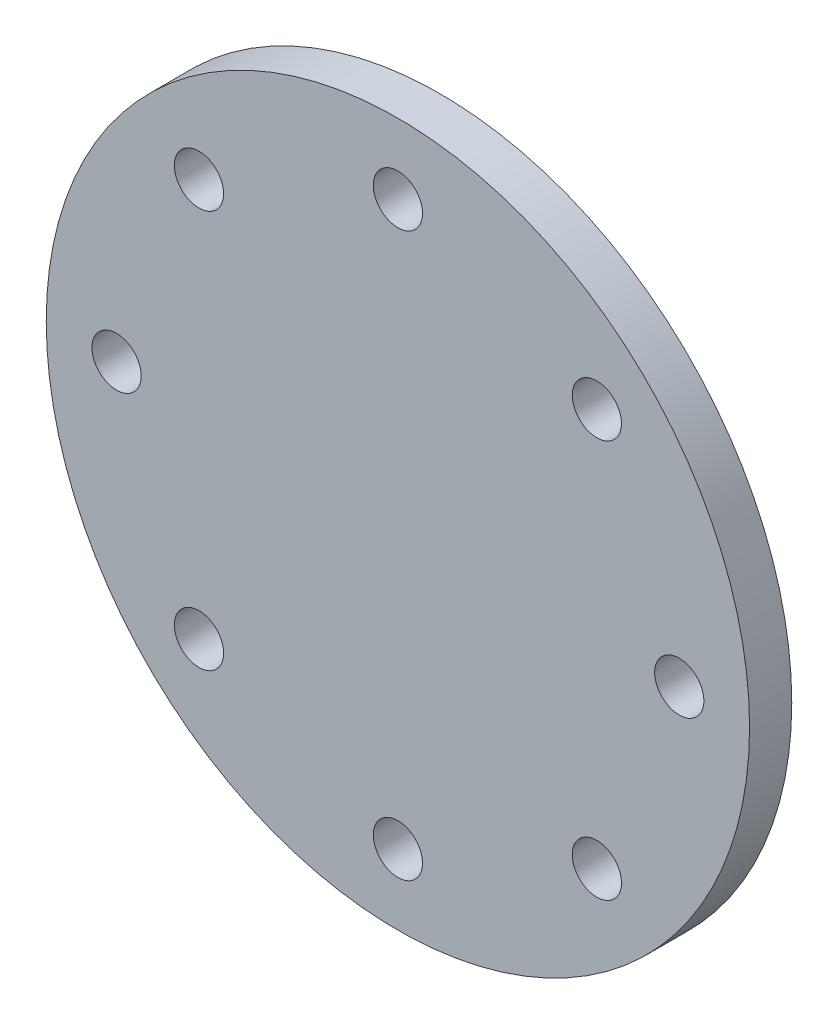
ISO-10303-21;
HEADER;
FILE_DESCRIPTION(('STEP AP214'),'2;1');
FILE_NAME('part.step','',(''),(''),'','','');
FILE_SCHEMA(('AUTOMOTIVE_DESIGN { 1 0 10303 214 1 1 1 1 }'));
ENDSEC;
DATA;
#1=APPLICATION_CONTEXT('core data for automotive mechanical design processes');
#2=APPLICATION_PROTOCOL_DEFINITION('international standard','automotive_design',2000,#1);
#3=PRODUCT_CONTEXT('',#1,'mechanical');
#4=PRODUCT('Part','Part','',(#3));
#5=PRODUCT_RELATED_PRODUCT_CATEGORY('part','',(#4));
#6=PRODUCT_DEFINITION_FORMATION('','',#4);
#7=PRODUCT_DEFINITION_CONTEXT('part definition',#1,'design');
#8=PRODUCT_DEFINITION('design','',#6,#7);
#9=PRODUCT_DEFINITION_SHAPE('','',#8);
#10=(LENGTH_UNIT() NAMED_UNIT(*) SI_UNIT(.MILLI.,.METRE.));
#11=(NAMED_UNIT(*) PLANE_ANGLE_UNIT() SI_UNIT($,.RADIAN.));
#12=(NAMED_UNIT(*) SI_UNIT($,.STERADIAN.) SOLID_ANGLE_UNIT());
#13=UNCERTAINTY_MEASURE_WITH_UNIT(LENGTH_MEASURE(1.E-05),#10,'distance_accuracy_value','');
#14=(GEOMETRIC_REPRESENTATION_CONTEXT(3) GLOBAL_UNCERTAINTY_ASSIGNED_CONTEXT((#13)) GLOBAL_UNIT_ASSIGNED_CONTEXT((#10,
#11,#12)) REPRESENTATION_CONTEXT('',''));
#15=CARTESIAN_POINT('',(0.,0.,0.));
#16=DIRECTION('',(0.,0.,1.));
#17=DIRECTION('',(1.,0.,0.));
#18=AXIS2_PLACEMENT_3D('',#15,#16,#17);
#19=CARTESIAN_POINT('',(0.,0.,3.));
#20=DIRECTION('',(0.,0.,-1.));
#21=DIRECTION('',(-1.,0.,0.));
#22=AXIS2_PLACEMENT_3D('',#19,#20,#21);
#23=CYLINDRICAL_SURFACE('',#22,25.);
#24=CARTESIAN_POINT('',(0.,0.,3.));
#25=DIRECTION('',(0.,0.,1.));
#26=DIRECTION('',(1.,0.,0.));
#27=AXIS2_PLACEMENT_3D('',#24,#25,#26);
#28=CIRCLE('',#27,25.);
#29=CARTESIAN_POINT('',(25.,0.,3.));
#30=VERTEX_POINT('',#29);
#31=EDGE_CURVE('E10',#30,#30,#28,.T.);
#32=ORIENTED_EDGE('',*,*,#31,.F.);
#33=EDGE_LOOP('',(#32));
#34=FACE_BOUND('',#33,.T.);
#35=CARTESIAN_POINT('',(0.,0.,0.));
#36=DIRECTION('',(0.,0.,1.));
#37=DIRECTION('',(1.,0.,0.));
#38=AXIS2_PLACEMENT_3D('',#35,#36,#37);
#39=CIRCLE('',#38,25.);
#40=CARTESIAN_POINT('',(25.,0.,0.));
#41=VERTEX_POINT('',#40);
#42=EDGE_CURVE('E34',#41,#41,#39,.T.);
#43=ORIENTED_EDGE('',*,*,#42,.T.);
#44=EDGE_LOOP('',(#43));
#45=FACE_BOUND('',#44,.T.);
#46=ADVANCED_FACE('F31',(#34,#45),#23,.T.);
#47=CARTESIAN_POINT('',(0.,0.,3.));
#48=DIRECTION('',(0.,0.,1.));
#49=DIRECTION('',(1.,0.,0.));
#50=AXIS2_PLACEMENT_3D('',#47,#48,#49);
#51=PLANE('',#50);
#52=CARTESIAN_POINT('',(14.1421356237308,14.1421356237311,3.));
#53=DIRECTION('',(0.,0.,1.));
#54=DIRECTION('',(0.707106781186556,-0.707106781186539,0.));
#55=AXIS2_PLACEMENT_3D('',#52,#53,#54);
#56=CIRCLE('',#55,1.75);
#57=CARTESIAN_POINT('',(15.3795724908073,12.9046987566547,3.));
#58=VERTEX_POINT('',#57);
#59=EDGE_CURVE('E85',#58,#58,#56,.T.);
#60=ORIENTED_EDGE('',*,*,#59,.F.);
#61=EDGE_LOOP('',(#60));
#62=FACE_BOUND('',#61,.T.);
#63=CARTESIAN_POINT('',(20.,2.09418175640307E-13,3.));
#64=DIRECTION('',(0.,0.,1.));
#65=DIRECTION('',(0.,-1.,0.));
#66=AXIS2_PLACEMENT_3D('',#63,#64,#65);
#67=CIRCLE('',#66,1.75);
#68=CARTESIAN_POINT('',(20.,-1.74999999999979,3.));
#69=VERTEX_POINT('',#68);
#70=EDGE_CURVE('E79',#69,#69,#67,.T.);
#71=ORIENTED_EDGE('',*,*,#70,.F.);
#72=EDGE_LOOP('',(#71));
#73=FACE_BOUND('',#72,.T.);
#74=CARTESIAN_POINT('',(14.1421356237311,-14.1421356237308,3.));
#75=DIRECTION('',(0.,0.,1.));
#76=DIRECTION('',(-0.707106781186541,-0.707106781186554,0.));
#77=AXIS2_PLACEMENT_3D('',#74,#75,#76);
#78=CIRCLE('',#77,1.75);
#79=CARTESIAN_POINT('',(12.9046987566546,-15.3795724908073,3.));
#80=VERTEX_POINT('',#79);
#81=EDGE_CURVE('E73',#80,#80,#78,.T.);
#82=ORIENTED_EDGE('',*,*,#81,.F.);
#83=EDGE_LOOP('',(#82));
#84=FACE_BOUND('',#83,.T.);
#85=CARTESIAN_POINT('',(0.,-20.,3.));
#86=DIRECTION('',(0.,0.,1.));
#87=DIRECTION('',(-1.,0.,0.));
#88=AXIS2_PLACEMENT_3D('',#85,#86,#87);
#89=CIRCLE('',#88,1.75);
#90=CARTESIAN_POINT('',(-1.75,-20.,3.));
#91=VERTEX_POINT('',#90);
#92=EDGE_CURVE('E67',#91,#91,#89,.T.);
#93=ORIENTED_EDGE('',*,*,#92,.F.);
#94=EDGE_LOOP('',(#93));
#95=FACE_BOUND('',#94,.T.);
#96=CARTESIAN_POINT('',(-14.1421356237309,-14.142135623731,3.));
#97=DIRECTION('',(0.,0.,1.));
#98=DIRECTION('',(-0.707106781186551,0.707106781186544,0.));
#99=AXIS2_PLACEMENT_3D('',#96,#97,#98);
#100=CIRCLE('',#99,1.75);
#101=CARTESIAN_POINT('',(-15.3795724908073,-12.9046987566546,3.));
#102=VERTEX_POINT('',#101);
#103=EDGE_CURVE('E61',#102,#102,#100,.T.);
#104=ORIENTED_EDGE('',*,*,#103,.F.);
#105=EDGE_LOOP('',(#104));
#106=FACE_BOUND('',#105,.T.);
#107=CARTESIAN_POINT('',(-20.,0.,3.));
#108=DIRECTION('',(0.,0.,1.));
#109=DIRECTION('',(0.,1.,0.));
#110=AXIS2_PLACEMENT_3D('',#107,#108,#109);
#111=CIRCLE('',#110,1.75);
#112=CARTESIAN_POINT('',(-20.,1.74999999999993,3.));
#113=VERTEX_POINT('',#112);
#114=EDGE_CURVE('E55',#113,#113,#111,.T.);
#115=ORIENTED_EDGE('',*,*,#114,.F.);
#116=EDGE_LOOP('',(#115));
#117=FACE_BOUND('',#116,.T.);
#118=CARTESIAN_POINT('',(-14.142135623731,14.1421356237309,3.));
#119=DIRECTION('',(0.,0.,1.));
#120=DIRECTION('',(0.707106781186546,0.707106781186549,0.));
#121=AXIS2_PLACEMENT_3D('',#118,#119,#120);
#122=CIRCLE('',#121,1.75);
#123=CARTESIAN_POINT('',(-12.9046987566545,15.3795724908074,3.));
#124=VERTEX_POINT('',#123);
#125=EDGE_CURVE('E49',#124,#124,#122,.T.);
#126=ORIENTED_EDGE('',*,*,#125,.F.);
#127=EDGE_LOOP('',(#126));
#128=FACE_BOUND('',#127,.T.);
#129=CARTESIAN_POINT('',(0.,20.,3.));
#130=DIRECTION('',(0.,0.,1.));
#131=DIRECTION('',(1.,0.,0.));
#132=AXIS2_PLACEMENT_3D('',#129,#130,#131);
#133=CIRCLE('',#132,1.75);
#134=CARTESIAN_POINT('',(1.75,20.,3.));
#135=VERTEX_POINT('',#134);
#136=EDGE_CURVE('E43',#135,#135,#133,.T.);
#137=ORIENTED_EDGE('',*,*,#136,.F.);
#138=EDGE_LOOP('',(#137));
#139=FACE_BOUND('',#138,.T.);
#140=ORIENTED_EDGE('',*,*,#31,.T.);
#141=EDGE_LOOP('',(#140));
#142=FACE_BOUND('',#141,.T.);
#143=ADVANCED_FACE('F101',(#62,#73,#84,#95,#106,#117,#128,#139,#142),#51,.T.);
#144=CARTESIAN_POINT('',(0.,0.,0.));
#145=DIRECTION('',(0.,0.,1.));
#146=DIRECTION('',(1.,0.,0.));
#147=AXIS2_PLACEMENT_3D('',#144,#145,#146);
#148=PLANE('',#147);
#149=CARTESIAN_POINT('',(14.1421356237308,14.1421356237311,0.));
#150=DIRECTION('',(0.,0.,1.));
#151=DIRECTION('',(0.707106781186556,-0.707106781186539,0.));
#152=AXIS2_PLACEMENT_3D('',#149,#150,#151);
#153=CIRCLE('',#152,1.75);
#154=CARTESIAN_POINT('',(15.3795724908073,12.9046987566547,0.));
#155=VERTEX_POINT('',#154);
#156=EDGE_CURVE('E82',#155,#155,#153,.T.);
#157=ORIENTED_EDGE('',*,*,#156,.T.);
#158=EDGE_LOOP('',(#157));
#159=FACE_BOUND('',#158,.T.);
#160=CARTESIAN_POINT('',(20.,2.09418175640307E-13,0.));
#161=DIRECTION('',(0.,0.,1.));
#162=DIRECTION('',(0.,-1.,0.));
#163=AXIS2_PLACEMENT_3D('',#160,#161,#162);
#164=CIRCLE('',#163,1.75);
#165=CARTESIAN_POINT('',(20.,-1.74999999999979,0.));
#166=VERTEX_POINT('',#165);
#167=EDGE_CURVE('E76',#166,#166,#164,.T.);
#168=ORIENTED_EDGE('',*,*,#167,.T.);
#169=EDGE_LOOP('',(#168));
#170=FACE_BOUND('',#169,.T.);
#171=CARTESIAN_POINT('',(14.1421356237311,-14.1421356237308,0.));
#172=DIRECTION('',(0.,0.,1.));
#173=DIRECTION('',(-0.707106781186541,-0.707106781186554,0.));
#174=AXIS2_PLACEMENT_3D('',#171,#172,#173);
#175=CIRCLE('',#174,1.75);
#176=CARTESIAN_POINT('',(12.9046987566546,-15.3795724908073,0.));
#177=VERTEX_POINT('',#176);
#178=EDGE_CURVE('E70',#177,#177,#175,.T.);
#179=ORIENTED_EDGE('',*,*,#178,.T.);
#180=EDGE_LOOP('',(#179));
#181=FACE_BOUND('',#180,.T.);
#182=CARTESIAN_POINT('',(0.,-20.,0.));
#183=DIRECTION('',(0.,0.,1.));
#184=DIRECTION('',(-1.,0.,0.));
#185=AXIS2_PLACEMENT_3D('',#182,#183,#184);
#186=CIRCLE('',#185,1.75);
#187=CARTESIAN_POINT('',(-1.75,-20.,0.));
#188=VERTEX_POINT('',#187);
#189=EDGE_CURVE('E64',#188,#188,#186,.T.);
#190=ORIENTED_EDGE('',*,*,#189,.T.);
#191=EDGE_LOOP('',(#190));
#192=FACE_BOUND('',#191,.T.);
#193=CARTESIAN_POINT('',(-14.1421356237309,-14.142135623731,0.));
#194=DIRECTION('',(0.,0.,1.));
#195=DIRECTION('',(-0.707106781186551,0.707106781186544,0.));
#196=AXIS2_PLACEMENT_3D('',#193,#194,#195);
#197=CIRCLE('',#196,1.75);
#198=CARTESIAN_POINT('',(-15.3795724908073,-12.9046987566546,0.));
#199=VERTEX_POINT('',#198);
#200=EDGE_CURVE('E58',#199,#199,#197,.T.);
#201=ORIENTED_EDGE('',*,*,#200,.T.);
#202=EDGE_LOOP('',(#201));
#203=FACE_BOUND('',#202,.T.);
#204=CARTESIAN_POINT('',(-20.,0.,0.));
#205=DIRECTION('',(0.,0.,1.));
#206=DIRECTION('',(0.,1.,0.));
#207=AXIS2_PLACEMENT_3D('',#204,#205,#206);
#208=CIRCLE('',#207,1.75);
#209=CARTESIAN_POINT('',(-20.,1.74999999999993,0.));
#210=VERTEX_POINT('',#209);
#211=EDGE_CURVE('E52',#210,#210,#208,.T.);
#212=ORIENTED_EDGE('',*,*,#211,.T.);
#213=EDGE_LOOP('',(#212));
#214=FACE_BOUND('',#213,.T.);
#215=CARTESIAN_POINT('',(-14.142135623731,14.1421356237309,0.));
#216=DIRECTION('',(0.,0.,1.));
#217=DIRECTION('',(0.707106781186546,0.707106781186549,0.));
#218=AXIS2_PLACEMENT_3D('',#215,#216,#217);
#219=CIRCLE('',#218,1.75);
#220=CARTESIAN_POINT('',(-12.9046987566545,15.3795724908074,0.));
#221=VERTEX_POINT('',#220);
#222=EDGE_CURVE('E46',#221,#221,#219,.T.);
#223=ORIENTED_EDGE('',*,*,#222,.T.);
#224=EDGE_LOOP('',(#223));
#225=FACE_BOUND('',#224,.T.);
#226=CARTESIAN_POINT('',(0.,20.,0.));
#227=DIRECTION('',(0.,0.,1.));
#228=DIRECTION('',(1.,0.,0.));
#229=AXIS2_PLACEMENT_3D('',#226,#227,#228);
#230=CIRCLE('',#229,1.75);
#231=CARTESIAN_POINT('',(1.75,20.,0.));
#232=VERTEX_POINT('',#231);
#233=EDGE_CURVE('E41',#232,#232,#230,.T.);
#234=ORIENTED_EDGE('',*,*,#233,.T.);
#235=EDGE_LOOP('',(#234));
#236=FACE_BOUND('',#235,.T.);
#237=ORIENTED_EDGE('',*,*,#42,.F.);
#238=EDGE_LOOP('',(#237));
#239=FACE_BOUND('',#238,.T.);
#240=ADVANCED_FACE('F91',(#159,#170,#181,#192,#203,#214,#225,#236,#239),#148,.F.);
#241=CARTESIAN_POINT('',(0.,20.,0.));
#242=DIRECTION('',(0.,0.,1.));
#243=DIRECTION('',(1.,0.,0.));
#244=AXIS2_PLACEMENT_3D('',#241,#242,#243);
#245=CYLINDRICAL_SURFACE('',#244,1.75);
#246=ORIENTED_EDGE('',*,*,#233,.F.);
#247=EDGE_LOOP('',(#246));
#248=FACE_BOUND('',#247,.T.);
#249=ORIENTED_EDGE('',*,*,#136,.T.);
#250=EDGE_LOOP('',(#249));
#251=FACE_BOUND('',#250,.T.);
#252=ADVANCED_FACE('F119',(#248,#251),#245,.F.);
#253=CARTESIAN_POINT('',(-14.142135623731,14.1421356237309,0.));
#254=DIRECTION('',(0.,0.,1.));
#255=DIRECTION('',(1.,0.,0.));
#256=AXIS2_PLACEMENT_3D('',#253,#254,#255);
#257=CYLINDRICAL_SURFACE('',#256,1.75);
#258=ORIENTED_EDGE('',*,*,#222,.F.);
#259=EDGE_LOOP('',(#258));
#260=FACE_BOUND('',#259,.T.);
#261=ORIENTED_EDGE('',*,*,#125,.T.);
#262=EDGE_LOOP('',(#261));
#263=FACE_BOUND('',#262,.T.);
#264=ADVANCED_FACE('F121',(#260,#263),#257,.F.);
#265=CARTESIAN_POINT('',(-20.,0.,0.));
#266=DIRECTION('',(0.,0.,1.));
#267=DIRECTION('',(1.,0.,0.));
#268=AXIS2_PLACEMENT_3D('',#265,#266,#267);
#269=CYLINDRICAL_SURFACE('',#268,1.75);
#270=ORIENTED_EDGE('',*,*,#211,.F.);
#271=EDGE_LOOP('',(#270));
#272=FACE_BOUND('',#271,.T.);
#273=ORIENTED_EDGE('',*,*,#114,.T.);
#274=EDGE_LOOP('',(#273));
#275=FACE_BOUND('',#274,.T.);
#276=ADVANCED_FACE('F128',(#272,#275),#269,.F.);
#277=CARTESIAN_POINT('',(-14.1421356237309,-14.142135623731,0.));
#278=DIRECTION('',(0.,0.,1.));
#279=DIRECTION('',(1.,0.,0.));
#280=AXIS2_PLACEMENT_3D('',#277,#278,#279);
#281=CYLINDRICAL_SURFACE('',#280,1.75);
#282=ORIENTED_EDGE('',*,*,#200,.F.);
#283=EDGE_LOOP('',(#282));
#284=FACE_BOUND('',#283,.T.);
#285=ORIENTED_EDGE('',*,*,#103,.T.);
#286=EDGE_LOOP('',(#285));
#287=FACE_BOUND('',#286,.T.);
#288=ADVANCED_FACE('F163',(#284,#287),#281,.F.);
#289=CARTESIAN_POINT('',(0.,-20.,0.));
#290=DIRECTION('',(0.,0.,1.));
#291=DIRECTION('',(1.,0.,0.));
#292=AXIS2_PLACEMENT_3D('',#289,#290,#291);
#293=CYLINDRICAL_SURFACE('',#292,1.75);
#294=ORIENTED_EDGE('',*,*,#189,.F.);
#295=EDGE_LOOP('',(#294));
#296=FACE_BOUND('',#295,.T.);
#297=ORIENTED_EDGE('',*,*,#92,.T.);
#298=EDGE_LOOP('',(#297));
#299=FACE_BOUND('',#298,.T.);
#300=ADVANCED_FACE('F173',(#296,#299),#293,.F.);
#301=CARTESIAN_POINT('',(14.1421356237311,-14.1421356237308,0.));
#302=DIRECTION('',(0.,0.,1.));
#303=DIRECTION('',(1.,0.,0.));
#304=AXIS2_PLACEMENT_3D('',#301,#302,#303);
#305=CYLINDRICAL_SURFACE('',#304,1.75);
#306=ORIENTED_EDGE('',*,*,#178,.F.);
#307=EDGE_LOOP('',(#306));
#308=FACE_BOUND('',#307,.T.);
#309=ORIENTED_EDGE('',*,*,#81,.T.);
#310=EDGE_LOOP('',(#309));
#311=FACE_BOUND('',#310,.T.);
#312=ADVANCED_FACE('F183',(#308,#311),#305,.F.);
#313=CARTESIAN_POINT('',(20.,2.09418175640307E-13,0.));
#314=DIRECTION('',(0.,0.,1.));
#315=DIRECTION('',(1.,0.,0.));
#316=AXIS2_PLACEMENT_3D('',#313,#314,#315);
#317=CYLINDRICAL_SURFACE('',#316,1.75);
#318=ORIENTED_EDGE('',*,*,#167,.F.);
#319=EDGE_LOOP('',(#318));
#320=FACE_BOUND('',#319,.T.);
#321=ORIENTED_EDGE('',*,*,#70,.T.);
#322=EDGE_LOOP('',(#321));
#323=FACE_BOUND('',#322,.T.);
#324=ADVANCED_FACE('F97',(#320,#323),#317,.F.);
#325=CARTESIAN_POINT('',(14.1421356237308,14.1421356237311,0.));
#326=DIRECTION('',(0.,0.,1.));
#327=DIRECTION('',(1.,0.,0.));
#328=AXIS2_PLACEMENT_3D('',#325,#326,#327);
#329=CYLINDRICAL_SURFACE('',#328,1.75);
#330=ORIENTED_EDGE('',*,*,#156,.F.);
#331=EDGE_LOOP('',(#330));
#332=FACE_BOUND('',#331,.T.);
#333=ORIENTED_EDGE('',*,*,#59,.T.);
#334=EDGE_LOOP('',(#333));
#335=FACE_BOUND('',#334,.T.);
#336=ADVANCED_FACE('F94',(#332,#335),#329,.F.);
#337=CLOSED_SHELL('',(#46,#143,#240,#252,#264,#276,#288,#300,#312,#324,#336));
#338=MANIFOLD_SOLID_BREP('B2',#337);
#339=ADVANCED_BREP_SHAPE_REPRESENTATION('',(#18,#338),#14);
#340=SHAPE_DEFINITION_REPRESENTATION(#9,#339);
ENDSEC;
END-ISO-10303-21;
